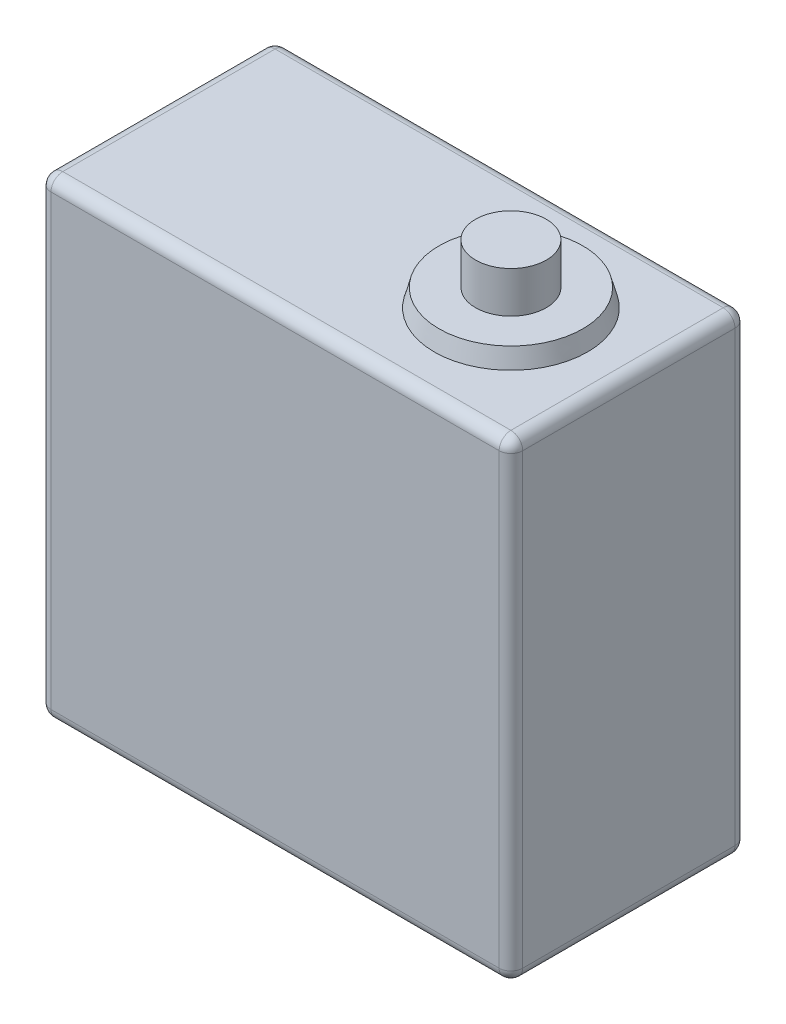
ISO-10303-21;
HEADER;
FILE_DESCRIPTION(('STEP AP214'),'2;1');
FILE_NAME('part.step','',(''),(''),'','','');
FILE_SCHEMA(('AUTOMOTIVE_DESIGN { 1 0 10303 214 1 1 1 1 }'));
ENDSEC;
DATA;
#1=APPLICATION_CONTEXT('core data for automotive mechanical design processes');
#2=APPLICATION_PROTOCOL_DEFINITION('international standard','automotive_design',2000,#1);
#3=PRODUCT_CONTEXT('',#1,'mechanical');
#4=PRODUCT('Part','Part','',(#3));
#5=PRODUCT_RELATED_PRODUCT_CATEGORY('part','',(#4));
#6=PRODUCT_DEFINITION_FORMATION('','',#4);
#7=PRODUCT_DEFINITION_CONTEXT('part definition',#1,'design');
#8=PRODUCT_DEFINITION('design','',#6,#7);
#9=PRODUCT_DEFINITION_SHAPE('','',#8);
#10=(LENGTH_UNIT() NAMED_UNIT(*) SI_UNIT(.MILLI.,.METRE.));
#11=(NAMED_UNIT(*) PLANE_ANGLE_UNIT() SI_UNIT($,.RADIAN.));
#12=(NAMED_UNIT(*) SI_UNIT($,.STERADIAN.) SOLID_ANGLE_UNIT());
#13=UNCERTAINTY_MEASURE_WITH_UNIT(LENGTH_MEASURE(1.E-05),#10,'distance_accuracy_value','');
#14=(GEOMETRIC_REPRESENTATION_CONTEXT(3) GLOBAL_UNCERTAINTY_ASSIGNED_CONTEXT((#13)) GLOBAL_UNIT_ASSIGNED_CONTEXT((#10,
#11,#12)) REPRESENTATION_CONTEXT('',''));
#15=CARTESIAN_POINT('',(0.,0.,0.));
#16=DIRECTION('',(0.,0.,1.));
#17=DIRECTION('',(1.,0.,0.));
#18=AXIS2_PLACEMENT_3D('',#15,#16,#17);
#19=CARTESIAN_POINT('',(20.,20.,20.));
#20=DIRECTION('',(-1.,0.,0.));
#21=DIRECTION('',(0.,-1.,0.));
#22=AXIS2_PLACEMENT_3D('',#19,#20,#21);
#23=PLANE('',#22);
#24=DIRECTION('',(0.,0.,-1.));
#25=VECTOR('',#24,1.);
#26=CARTESIAN_POINT('',(20.,-19.,20.));
#27=LINE('',#26,#25);
#28=CARTESIAN_POINT('',(20.,-19.,19.));
#29=VERTEX_POINT('',#28);
#30=CARTESIAN_POINT('',(20.,-19.,1.));
#31=VERTEX_POINT('',#30);
#32=EDGE_CURVE('E167',#29,#31,#27,.T.);
#33=ORIENTED_EDGE('',*,*,#32,.T.);
#34=DIRECTION('',(0.,1.,0.));
#35=VECTOR('',#34,1.);
#36=CARTESIAN_POINT('',(20.,20.,1.));
#37=LINE('',#36,#35);
#38=CARTESIAN_POINT('',(20.,19.,1.));
#39=VERTEX_POINT('',#38);
#40=EDGE_CURVE('E302',#31,#39,#37,.T.);
#41=ORIENTED_EDGE('',*,*,#40,.T.);
#42=DIRECTION('',(0.,0.,-1.));
#43=VECTOR('',#42,1.);
#44=CARTESIAN_POINT('',(20.,19.,20.));
#45=LINE('',#44,#43);
#46=CARTESIAN_POINT('',(20.,19.,19.));
#47=VERTEX_POINT('',#46);
#48=EDGE_CURVE('E294',#39,#47,#45,.F.);
#49=ORIENTED_EDGE('',*,*,#48,.T.);
#50=DIRECTION('',(0.,1.,0.));
#51=VECTOR('',#50,1.);
#52=CARTESIAN_POINT('',(20.,-20.,19.));
#53=LINE('',#52,#51);
#54=EDGE_CURVE('E290',#47,#29,#53,.F.);
#55=ORIENTED_EDGE('',*,*,#54,.T.);
#56=EDGE_LOOP('',(#33,#41,#49,#55));
#57=FACE_BOUND('',#56,.T.);
#58=ADVANCED_FACE('F41',(#57),#23,.F.);
#59=CARTESIAN_POINT('',(-20.,20.,20.));
#60=DIRECTION('',(0.,-1.,0.));
#61=DIRECTION('',(0.,0.,-1.));
#62=AXIS2_PLACEMENT_3D('',#59,#60,#61);
#63=PLANE('',#62);
#64=CARTESIAN_POINT('',(10.,20.,10.));
#65=DIRECTION('',(0.,-1.,0.));
#66=DIRECTION('',(0.,0.,-1.));
#67=AXIS2_PLACEMENT_3D('',#64,#65,#66);
#68=CIRCLE('',#67,6.5);
#69=CARTESIAN_POINT('',(10.,20.,3.5));
#70=VERTEX_POINT('',#69);
#71=EDGE_CURVE('E229',#70,#70,#68,.F.);
#72=ORIENTED_EDGE('',*,*,#71,.F.);
#73=EDGE_LOOP('',(#72));
#74=FACE_BOUND('',#73,.T.);
#75=DIRECTION('',(0.,0.,-1.));
#76=VECTOR('',#75,1.);
#77=CARTESIAN_POINT('',(-19.,20.,20.));
#78=LINE('',#77,#76);
#79=CARTESIAN_POINT('',(-19.,20.,1.));
#80=VERTEX_POINT('',#79);
#81=CARTESIAN_POINT('',(-19.,20.,19.));
#82=VERTEX_POINT('',#81);
#83=EDGE_CURVE('E309',#80,#82,#78,.F.);
#84=ORIENTED_EDGE('',*,*,#83,.T.);
#85=DIRECTION('',(-1.,0.,0.));
#86=VECTOR('',#85,1.);
#87=CARTESIAN_POINT('',(20.,20.,19.));
#88=LINE('',#87,#86);
#89=CARTESIAN_POINT('',(19.,20.,19.));
#90=VERTEX_POINT('',#89);
#91=EDGE_CURVE('E316',#82,#90,#88,.F.);
#92=ORIENTED_EDGE('',*,*,#91,.T.);
#93=DIRECTION('',(0.,0.,-1.));
#94=VECTOR('',#93,1.);
#95=CARTESIAN_POINT('',(19.,20.,20.));
#96=LINE('',#95,#94);
#97=CARTESIAN_POINT('',(19.,20.,1.));
#98=VERTEX_POINT('',#97);
#99=EDGE_CURVE('E312',#90,#98,#96,.T.);
#100=ORIENTED_EDGE('',*,*,#99,.T.);
#101=DIRECTION('',(-1.,0.,0.));
#102=VECTOR('',#101,1.);
#103=CARTESIAN_POINT('',(-20.,20.,1.));
#104=LINE('',#103,#102);
#105=EDGE_CURVE('E306',#98,#80,#104,.T.);
#106=ORIENTED_EDGE('',*,*,#105,.T.);
#107=EDGE_LOOP('',(#84,#92,#100,#106));
#108=FACE_BOUND('',#107,.T.);
#109=ADVANCED_FACE('F356',(#74,#108),#63,.F.);
#110=CARTESIAN_POINT('',(-20.,20.,20.));
#111=DIRECTION('',(1.,0.,0.));
#112=DIRECTION('',(0.,1.,0.));
#113=AXIS2_PLACEMENT_3D('',#110,#111,#112);
#114=PLANE('',#113);
#115=DIRECTION('',(0.,0.,-1.));
#116=VECTOR('',#115,1.);
#117=CARTESIAN_POINT('',(-20.,-19.,20.));
#118=LINE('',#117,#116);
#119=CARTESIAN_POINT('',(-20.,-19.,1.));
#120=VERTEX_POINT('',#119);
#121=CARTESIAN_POINT('',(-20.,-19.,19.));
#122=VERTEX_POINT('',#121);
#123=EDGE_CURVE('E322',#120,#122,#118,.F.);
#124=ORIENTED_EDGE('',*,*,#123,.T.);
#125=DIRECTION('',(0.,-1.,0.));
#126=VECTOR('',#125,1.);
#127=CARTESIAN_POINT('',(-20.,20.,19.));
#128=LINE('',#127,#126);
#129=CARTESIAN_POINT('',(-20.,19.,19.));
#130=VERTEX_POINT('',#129);
#131=EDGE_CURVE('E329',#122,#130,#128,.F.);
#132=ORIENTED_EDGE('',*,*,#131,.T.);
#133=DIRECTION('',(0.,0.,-1.));
#134=VECTOR('',#133,1.);
#135=CARTESIAN_POINT('',(-20.,19.,20.));
#136=LINE('',#135,#134);
#137=CARTESIAN_POINT('',(-20.,19.,1.));
#138=VERTEX_POINT('',#137);
#139=EDGE_CURVE('E325',#130,#138,#136,.T.);
#140=ORIENTED_EDGE('',*,*,#139,.T.);
#141=DIRECTION('',(0.,-1.,0.));
#142=VECTOR('',#141,1.);
#143=CARTESIAN_POINT('',(-20.,20.,1.));
#144=LINE('',#143,#142);
#145=EDGE_CURVE('E319',#138,#120,#144,.T.);
#146=ORIENTED_EDGE('',*,*,#145,.T.);
#147=EDGE_LOOP('',(#124,#132,#140,#146));
#148=FACE_BOUND('',#147,.T.);
#149=ADVANCED_FACE('F367',(#148),#114,.F.);
#150=CARTESIAN_POINT('',(-20.,-20.,20.));
#151=DIRECTION('',(0.,1.,0.));
#152=DIRECTION('',(0.,0.,1.));
#153=AXIS2_PLACEMENT_3D('',#150,#151,#152);
#154=PLANE('',#153);
#155=CARTESIAN_POINT('',(10.,-20.,10.));
#156=DIRECTION('',(0.,1.,0.));
#157=DIRECTION('',(0.,0.,1.));
#158=AXIS2_PLACEMENT_3D('',#155,#156,#157);
#159=CIRCLE('',#158,6.5);
#160=CARTESIAN_POINT('',(10.,-20.,16.5));
#161=VERTEX_POINT('',#160);
#162=EDGE_CURVE('E45',#161,#161,#159,.F.);
#163=ORIENTED_EDGE('',*,*,#162,.F.);
#164=EDGE_LOOP('',(#163));
#165=FACE_BOUND('',#164,.T.);
#166=DIRECTION('',(0.,0.,-1.));
#167=VECTOR('',#166,1.);
#168=CARTESIAN_POINT('',(-19.,-20.,20.));
#169=LINE('',#168,#167);
#170=CARTESIAN_POINT('',(-19.,-20.,19.));
#171=VERTEX_POINT('',#170);
#172=CARTESIAN_POINT('',(-19.,-20.,1.));
#173=VERTEX_POINT('',#172);
#174=EDGE_CURVE('E143',#171,#173,#169,.T.);
#175=ORIENTED_EDGE('',*,*,#174,.T.);
#176=DIRECTION('',(1.,0.,0.));
#177=VECTOR('',#176,1.);
#178=CARTESIAN_POINT('',(-20.,-20.,1.));
#179=LINE('',#178,#177);
#180=CARTESIAN_POINT('',(19.,-20.,1.));
#181=VERTEX_POINT('',#180);
#182=EDGE_CURVE('E138',#173,#181,#179,.T.);
#183=ORIENTED_EDGE('',*,*,#182,.T.);
#184=DIRECTION('',(0.,0.,-1.));
#185=VECTOR('',#184,1.);
#186=CARTESIAN_POINT('',(19.,-20.,20.));
#187=LINE('',#186,#185);
#188=CARTESIAN_POINT('',(19.,-20.,19.));
#189=VERTEX_POINT('',#188);
#190=EDGE_CURVE('E132',#181,#189,#187,.F.);
#191=ORIENTED_EDGE('',*,*,#190,.T.);
#192=DIRECTION('',(1.,0.,0.));
#193=VECTOR('',#192,1.);
#194=CARTESIAN_POINT('',(-20.,-20.,19.));
#195=LINE('',#194,#193);
#196=EDGE_CURVE('E135',#189,#171,#195,.F.);
#197=ORIENTED_EDGE('',*,*,#196,.T.);
#198=EDGE_LOOP('',(#175,#183,#191,#197));
#199=FACE_BOUND('',#198,.T.);
#200=ADVANCED_FACE('F134',(#165,#199),#154,.F.);
#201=CARTESIAN_POINT('',(0.,0.,20.));
#202=DIRECTION('',(0.,0.,1.));
#203=DIRECTION('',(1.,0.,0.));
#204=AXIS2_PLACEMENT_3D('',#201,#202,#203);
#205=PLANE('',#204);
#206=DIRECTION('',(0.,-1.,0.));
#207=VECTOR('',#206,1.);
#208=CARTESIAN_POINT('',(-19.,-20.,20.));
#209=LINE('',#208,#207);
#210=CARTESIAN_POINT('',(-19.,19.,20.));
#211=VERTEX_POINT('',#210);
#212=CARTESIAN_POINT('',(-19.,-19.,20.));
#213=VERTEX_POINT('',#212);
#214=EDGE_CURVE('E58',#211,#213,#209,.T.);
#215=ORIENTED_EDGE('',*,*,#214,.T.);
#216=DIRECTION('',(1.,0.,0.));
#217=VECTOR('',#216,1.);
#218=CARTESIAN_POINT('',(20.,-19.,20.));
#219=LINE('',#218,#217);
#220=CARTESIAN_POINT('',(19.,-19.,20.));
#221=VERTEX_POINT('',#220);
#222=EDGE_CURVE('E233',#213,#221,#219,.T.);
#223=ORIENTED_EDGE('',*,*,#222,.T.);
#224=DIRECTION('',(0.,1.,0.));
#225=VECTOR('',#224,1.);
#226=CARTESIAN_POINT('',(19.,20.,20.));
#227=LINE('',#226,#225);
#228=CARTESIAN_POINT('',(19.,19.,20.));
#229=VERTEX_POINT('',#228);
#230=EDGE_CURVE('E332',#221,#229,#227,.T.);
#231=ORIENTED_EDGE('',*,*,#230,.T.);
#232=DIRECTION('',(-1.,0.,0.));
#233=VECTOR('',#232,1.);
#234=CARTESIAN_POINT('',(-20.,19.,20.));
#235=LINE('',#234,#233);
#236=EDGE_CURVE('E63',#229,#211,#235,.T.);
#237=ORIENTED_EDGE('',*,*,#236,.T.);
#238=EDGE_LOOP('',(#215,#223,#231,#237));
#239=FACE_BOUND('',#238,.T.);
#240=ADVANCED_FACE('F335',(#239),#205,.T.);
#241=CARTESIAN_POINT('',(0.,0.,0.));
#242=DIRECTION('',(0.,0.,1.));
#243=DIRECTION('',(1.,0.,0.));
#244=AXIS2_PLACEMENT_3D('',#241,#242,#243);
#245=PLANE('',#244);
#246=DIRECTION('',(0.,1.,0.));
#247=VECTOR('',#246,1.);
#248=CARTESIAN_POINT('',(19.,0.,0.));
#249=LINE('',#248,#247);
#250=CARTESIAN_POINT('',(19.,19.,0.));
#251=VERTEX_POINT('',#250);
#252=CARTESIAN_POINT('',(19.,-19.,0.));
#253=VERTEX_POINT('',#252);
#254=EDGE_CURVE('E279',#251,#253,#249,.F.);
#255=ORIENTED_EDGE('',*,*,#254,.T.);
#256=DIRECTION('',(1.,0.,0.));
#257=VECTOR('',#256,1.);
#258=CARTESIAN_POINT('',(0.,-19.,0.));
#259=LINE('',#258,#257);
#260=CARTESIAN_POINT('',(-19.,-19.,0.));
#261=VERTEX_POINT('',#260);
#262=EDGE_CURVE('E283',#253,#261,#259,.F.);
#263=ORIENTED_EDGE('',*,*,#262,.T.);
#264=DIRECTION('',(0.,-1.,0.));
#265=VECTOR('',#264,1.);
#266=CARTESIAN_POINT('',(-19.,0.,0.));
#267=LINE('',#266,#265);
#268=CARTESIAN_POINT('',(-19.,19.,0.));
#269=VERTEX_POINT('',#268);
#270=EDGE_CURVE('E272',#261,#269,#267,.F.);
#271=ORIENTED_EDGE('',*,*,#270,.T.);
#272=DIRECTION('',(-1.,0.,0.));
#273=VECTOR('',#272,1.);
#274=CARTESIAN_POINT('',(0.,19.,0.));
#275=LINE('',#274,#273);
#276=EDGE_CURVE('E280',#269,#251,#275,.F.);
#277=ORIENTED_EDGE('',*,*,#276,.T.);
#278=EDGE_LOOP('',(#255,#263,#271,#277));
#279=FACE_BOUND('',#278,.T.);
#280=ADVANCED_FACE('F284',(#279),#245,.F.);
#281=CARTESIAN_POINT('',(0.,19.,19.));
#282=DIRECTION('',(1.,0.,0.));
#283=DIRECTION('',(0.,0.,-1.));
#284=AXIS2_PLACEMENT_3D('',#281,#282,#283);
#285=CYLINDRICAL_SURFACE('',#284,1.);
#286=CARTESIAN_POINT('',(-19.,19.,19.));
#287=DIRECTION('',(-1.,0.,0.));
#288=DIRECTION('',(0.,-1.,0.));
#289=AXIS2_PLACEMENT_3D('',#286,#287,#288);
#290=CIRCLE('',#289,1.);
#291=EDGE_CURVE('E155',#211,#82,#290,.T.);
#292=ORIENTED_EDGE('',*,*,#291,.F.);
#293=ORIENTED_EDGE('',*,*,#236,.F.);
#294=CARTESIAN_POINT('',(19.,19.,19.));
#295=DIRECTION('',(1.,0.,0.));
#296=DIRECTION('',(0.,0.,-1.));
#297=AXIS2_PLACEMENT_3D('',#294,#295,#296);
#298=CIRCLE('',#297,1.);
#299=EDGE_CURVE('E223',#90,#229,#298,.T.);
#300=ORIENTED_EDGE('',*,*,#299,.F.);
#301=ORIENTED_EDGE('',*,*,#91,.F.);
#302=EDGE_LOOP('',(#292,#293,#300,#301));
#303=FACE_BOUND('',#302,.T.);
#304=ADVANCED_FACE('F43',(#303),#285,.T.);
#305=CARTESIAN_POINT('',(-19.,19.,19.));
#306=DIRECTION('',(0.,1.,0.));
#307=DIRECTION('',(0.,0.,1.));
#308=AXIS2_PLACEMENT_3D('',#305,#306,#307);
#309=SPHERICAL_SURFACE('',#308,1.);
#310=CARTESIAN_POINT('',(-19.,19.,19.));
#311=DIRECTION('',(0.,1.,0.));
#312=DIRECTION('',(0.,0.,1.));
#313=AXIS2_PLACEMENT_3D('',#310,#311,#312);
#314=CIRCLE('',#313,1.);
#315=EDGE_CURVE('E215',#211,#130,#314,.F.);
#316=ORIENTED_EDGE('',*,*,#315,.F.);
#317=ORIENTED_EDGE('',*,*,#291,.T.);
#318=CARTESIAN_POINT('',(-19.,19.,19.));
#319=DIRECTION('',(0.,0.,1.));
#320=DIRECTION('',(1.,0.,0.));
#321=AXIS2_PLACEMENT_3D('',#318,#319,#320);
#322=CIRCLE('',#321,1.);
#323=EDGE_CURVE('E219',#130,#82,#322,.F.);
#324=ORIENTED_EDGE('',*,*,#323,.F.);
#325=EDGE_LOOP('',(#316,#317,#324));
#326=FACE_BOUND('',#325,.T.);
#327=ADVANCED_FACE('F360',(#326),#309,.T.);
#328=CARTESIAN_POINT('',(19.,19.,19.));
#329=DIRECTION('',(0.,0.,1.));
#330=DIRECTION('',(1.,0.,0.));
#331=AXIS2_PLACEMENT_3D('',#328,#329,#330);
#332=SPHERICAL_SURFACE('',#331,1.);
#333=CARTESIAN_POINT('',(19.,19.,19.));
#334=DIRECTION('',(0.,0.,1.));
#335=DIRECTION('',(1.,0.,0.));
#336=AXIS2_PLACEMENT_3D('',#333,#334,#335);
#337=CIRCLE('',#336,1.);
#338=EDGE_CURVE('E207',#90,#47,#337,.F.);
#339=ORIENTED_EDGE('',*,*,#338,.F.);
#340=ORIENTED_EDGE('',*,*,#299,.T.);
#341=CARTESIAN_POINT('',(19.,19.,19.));
#342=DIRECTION('',(0.,1.,0.));
#343=DIRECTION('',(0.,0.,1.));
#344=AXIS2_PLACEMENT_3D('',#341,#342,#343);
#345=CIRCLE('',#344,1.);
#346=EDGE_CURVE('E211',#47,#229,#345,.F.);
#347=ORIENTED_EDGE('',*,*,#346,.F.);
#348=EDGE_LOOP('',(#339,#340,#347));
#349=FACE_BOUND('',#348,.T.);
#350=ADVANCED_FACE('F344',(#349),#332,.T.);
#351=CARTESIAN_POINT('',(-19.,19.,20.));
#352=DIRECTION('',(0.,0.,-1.));
#353=DIRECTION('',(-1.,0.,0.));
#354=AXIS2_PLACEMENT_3D('',#351,#352,#353);
#355=CYLINDRICAL_SURFACE('',#354,1.);
#356=ORIENTED_EDGE('',*,*,#323,.T.);
#357=ORIENTED_EDGE('',*,*,#83,.F.);
#358=CARTESIAN_POINT('',(-19.,19.,1.));
#359=DIRECTION('',(0.,0.,-1.));
#360=DIRECTION('',(-1.,0.,0.));
#361=AXIS2_PLACEMENT_3D('',#358,#359,#360);
#362=CIRCLE('',#361,1.);
#363=EDGE_CURVE('E199',#138,#80,#362,.T.);
#364=ORIENTED_EDGE('',*,*,#363,.F.);
#365=ORIENTED_EDGE('',*,*,#139,.F.);
#366=EDGE_LOOP('',(#356,#357,#364,#365));
#367=FACE_BOUND('',#366,.T.);
#368=ADVANCED_FACE('F363',(#367),#355,.T.);
#369=CARTESIAN_POINT('',(-19.,0.,19.));
#370=DIRECTION('',(0.,1.,0.));
#371=DIRECTION('',(-1.,0.,0.));
#372=AXIS2_PLACEMENT_3D('',#369,#370,#371);
#373=CYLINDRICAL_SURFACE('',#372,1.);
#374=ORIENTED_EDGE('',*,*,#315,.T.);
#375=ORIENTED_EDGE('',*,*,#131,.F.);
#376=CARTESIAN_POINT('',(-19.,-19.,19.));
#377=DIRECTION('',(0.,-1.,0.));
#378=DIRECTION('',(0.,0.,-1.));
#379=AXIS2_PLACEMENT_3D('',#376,#377,#378);
#380=CIRCLE('',#379,1.);
#381=EDGE_CURVE('E195',#213,#122,#380,.T.);
#382=ORIENTED_EDGE('',*,*,#381,.F.);
#383=ORIENTED_EDGE('',*,*,#214,.F.);
#384=EDGE_LOOP('',(#374,#375,#382,#383));
#385=FACE_BOUND('',#384,.T.);
#386=ADVANCED_FACE('F372',(#385),#373,.T.);
#387=CARTESIAN_POINT('',(0.,-19.,19.));
#388=DIRECTION('',(-1.,0.,0.));
#389=DIRECTION('',(0.,0.,1.));
#390=AXIS2_PLACEMENT_3D('',#387,#388,#389);
#391=CYLINDRICAL_SURFACE('',#390,1.);
#392=CARTESIAN_POINT('',(19.,-19.,19.));
#393=DIRECTION('',(1.,0.,0.));
#394=DIRECTION('',(0.,0.,-1.));
#395=AXIS2_PLACEMENT_3D('',#392,#393,#394);
#396=CIRCLE('',#395,1.);
#397=EDGE_CURVE('E149',#221,#189,#396,.T.);
#398=ORIENTED_EDGE('',*,*,#397,.F.);
#399=ORIENTED_EDGE('',*,*,#222,.F.);
#400=CARTESIAN_POINT('',(-19.,-19.,19.));
#401=DIRECTION('',(-1.,0.,0.));
#402=DIRECTION('',(0.,0.,1.));
#403=AXIS2_PLACEMENT_3D('',#400,#401,#402);
#404=CIRCLE('',#403,1.);
#405=EDGE_CURVE('E152',#171,#213,#404,.T.);
#406=ORIENTED_EDGE('',*,*,#405,.F.);
#407=ORIENTED_EDGE('',*,*,#196,.F.);
#408=EDGE_LOOP('',(#398,#399,#406,#407));
#409=FACE_BOUND('',#408,.T.);
#410=ADVANCED_FACE('F148',(#409),#391,.T.);
#411=CARTESIAN_POINT('',(19.,0.,19.));
#412=DIRECTION('',(0.,-1.,0.));
#413=DIRECTION('',(1.,0.,0.));
#414=AXIS2_PLACEMENT_3D('',#411,#412,#413);
#415=CYLINDRICAL_SURFACE('',#414,1.);
#416=ORIENTED_EDGE('',*,*,#346,.T.);
#417=ORIENTED_EDGE('',*,*,#230,.F.);
#418=CARTESIAN_POINT('',(19.,-19.,19.));
#419=DIRECTION('',(0.,-1.,0.));
#420=DIRECTION('',(0.,0.,-1.));
#421=AXIS2_PLACEMENT_3D('',#418,#419,#420);
#422=CIRCLE('',#421,1.);
#423=EDGE_CURVE('E163',#29,#221,#422,.T.);
#424=ORIENTED_EDGE('',*,*,#423,.F.);
#425=ORIENTED_EDGE('',*,*,#54,.F.);
#426=EDGE_LOOP('',(#416,#417,#424,#425));
#427=FACE_BOUND('',#426,.T.);
#428=ADVANCED_FACE('F347',(#427),#415,.T.);
#429=CARTESIAN_POINT('',(19.,19.,20.));
#430=DIRECTION('',(0.,0.,-1.));
#431=DIRECTION('',(-1.,0.,0.));
#432=AXIS2_PLACEMENT_3D('',#429,#430,#431);
#433=CYLINDRICAL_SURFACE('',#432,1.);
#434=ORIENTED_EDGE('',*,*,#338,.T.);
#435=ORIENTED_EDGE('',*,*,#48,.F.);
#436=CARTESIAN_POINT('',(19.,19.,1.));
#437=DIRECTION('',(0.,0.,-1.));
#438=DIRECTION('',(-1.,0.,0.));
#439=AXIS2_PLACEMENT_3D('',#436,#437,#438);
#440=CIRCLE('',#439,1.);
#441=EDGE_CURVE('E187',#98,#39,#440,.T.);
#442=ORIENTED_EDGE('',*,*,#441,.F.);
#443=ORIENTED_EDGE('',*,*,#99,.F.);
#444=EDGE_LOOP('',(#434,#435,#442,#443));
#445=FACE_BOUND('',#444,.T.);
#446=ADVANCED_FACE('F353',(#445),#433,.T.);
#447=CARTESIAN_POINT('',(-20.,19.,1.));
#448=DIRECTION('',(-1.,0.,0.));
#449=DIRECTION('',(0.,0.,1.));
#450=AXIS2_PLACEMENT_3D('',#447,#448,#449);
#451=CYLINDRICAL_SURFACE('',#450,1.);
#452=CARTESIAN_POINT('',(-19.,19.,1.));
#453=DIRECTION('',(-1.,0.,0.));
#454=DIRECTION('',(0.,0.,1.));
#455=AXIS2_PLACEMENT_3D('',#452,#453,#454);
#456=CIRCLE('',#455,1.);
#457=EDGE_CURVE('E203',#80,#269,#456,.T.);
#458=ORIENTED_EDGE('',*,*,#457,.F.);
#459=ORIENTED_EDGE('',*,*,#105,.F.);
#460=CARTESIAN_POINT('',(19.,19.,1.));
#461=DIRECTION('',(1.,0.,0.));
#462=DIRECTION('',(0.,0.,-1.));
#463=AXIS2_PLACEMENT_3D('',#460,#461,#462);
#464=CIRCLE('',#463,1.);
#465=EDGE_CURVE('E184',#251,#98,#464,.T.);
#466=ORIENTED_EDGE('',*,*,#465,.F.);
#467=ORIENTED_EDGE('',*,*,#276,.F.);
#468=EDGE_LOOP('',(#458,#459,#466,#467));
#469=FACE_BOUND('',#468,.T.);
#470=ADVANCED_FACE('F388',(#469),#451,.T.);
#471=CARTESIAN_POINT('',(-19.,19.,1.));
#472=DIRECTION('',(0.,1.,0.));
#473=DIRECTION('',(0.,0.,1.));
#474=AXIS2_PLACEMENT_3D('',#471,#472,#473);
#475=SPHERICAL_SURFACE('',#474,1.);
#476=ORIENTED_EDGE('',*,*,#363,.T.);
#477=ORIENTED_EDGE('',*,*,#457,.T.);
#478=CARTESIAN_POINT('',(-19.,19.,1.));
#479=DIRECTION('',(0.,1.,0.));
#480=DIRECTION('',(0.,0.,1.));
#481=AXIS2_PLACEMENT_3D('',#478,#479,#480);
#482=CIRCLE('',#481,1.);
#483=EDGE_CURVE('E175',#138,#269,#482,.F.);
#484=ORIENTED_EDGE('',*,*,#483,.F.);
#485=EDGE_LOOP('',(#476,#477,#484));
#486=FACE_BOUND('',#485,.T.);
#487=ADVANCED_FACE('F592',(#486),#475,.T.);
#488=CARTESIAN_POINT('',(-19.,-19.,19.));
#489=DIRECTION('',(0.,0.,1.));
#490=DIRECTION('',(1.,0.,0.));
#491=AXIS2_PLACEMENT_3D('',#488,#489,#490);
#492=SPHERICAL_SURFACE('',#491,1.);
#493=ORIENTED_EDGE('',*,*,#405,.T.);
#494=ORIENTED_EDGE('',*,*,#381,.T.);
#495=CARTESIAN_POINT('',(-19.,-19.,19.));
#496=DIRECTION('',(0.,0.,1.));
#497=DIRECTION('',(1.,0.,0.));
#498=AXIS2_PLACEMENT_3D('',#495,#496,#497);
#499=CIRCLE('',#498,1.);
#500=EDGE_CURVE('E169',#171,#122,#499,.F.);
#501=ORIENTED_EDGE('',*,*,#500,.F.);
#502=EDGE_LOOP('',(#493,#494,#501));
#503=FACE_BOUND('',#502,.T.);
#504=ADVANCED_FACE('F374',(#503),#492,.T.);
#505=CARTESIAN_POINT('',(19.,-19.,19.));
#506=DIRECTION('',(0.,0.,1.));
#507=DIRECTION('',(1.,0.,0.));
#508=AXIS2_PLACEMENT_3D('',#505,#506,#507);
#509=SPHERICAL_SURFACE('',#508,1.);
#510=ORIENTED_EDGE('',*,*,#423,.T.);
#511=ORIENTED_EDGE('',*,*,#397,.T.);
#512=CARTESIAN_POINT('',(19.,-19.,19.));
#513=DIRECTION('',(0.,0.,1.));
#514=DIRECTION('',(1.,0.,0.));
#515=AXIS2_PLACEMENT_3D('',#512,#513,#514);
#516=CIRCLE('',#515,1.);
#517=EDGE_CURVE('E160',#29,#189,#516,.F.);
#518=ORIENTED_EDGE('',*,*,#517,.F.);
#519=EDGE_LOOP('',(#510,#511,#518));
#520=FACE_BOUND('',#519,.T.);
#521=ADVANCED_FACE('F159',(#520),#509,.T.);
#522=CARTESIAN_POINT('',(19.,19.,1.));
#523=DIRECTION('',(0.,1.,0.));
#524=DIRECTION('',(0.,0.,1.));
#525=AXIS2_PLACEMENT_3D('',#522,#523,#524);
#526=SPHERICAL_SURFACE('',#525,1.);
#527=ORIENTED_EDGE('',*,*,#465,.T.);
#528=ORIENTED_EDGE('',*,*,#441,.T.);
#529=CARTESIAN_POINT('',(19.,19.,1.));
#530=DIRECTION('',(0.,1.,0.));
#531=DIRECTION('',(0.,0.,1.));
#532=AXIS2_PLACEMENT_3D('',#529,#530,#531);
#533=CIRCLE('',#532,1.);
#534=EDGE_CURVE('E170',#251,#39,#533,.F.);
#535=ORIENTED_EDGE('',*,*,#534,.F.);
#536=EDGE_LOOP('',(#527,#528,#535));
#537=FACE_BOUND('',#536,.T.);
#538=ADVANCED_FACE('F390',(#537),#526,.T.);
#539=CARTESIAN_POINT('',(-19.,20.,1.));
#540=DIRECTION('',(0.,-1.,0.));
#541=DIRECTION('',(1.,0.,0.));
#542=AXIS2_PLACEMENT_3D('',#539,#540,#541);
#543=CYLINDRICAL_SURFACE('',#542,1.);
#544=ORIENTED_EDGE('',*,*,#483,.T.);
#545=ORIENTED_EDGE('',*,*,#270,.F.);
#546=CARTESIAN_POINT('',(-19.,-19.,1.));
#547=DIRECTION('',(0.,-1.,0.));
#548=DIRECTION('',(0.,0.,-1.));
#549=AXIS2_PLACEMENT_3D('',#546,#547,#548);
#550=CIRCLE('',#549,1.);
#551=EDGE_CURVE('E177',#120,#261,#550,.T.);
#552=ORIENTED_EDGE('',*,*,#551,.F.);
#553=ORIENTED_EDGE('',*,*,#145,.F.);
#554=EDGE_LOOP('',(#544,#545,#552,#553));
#555=FACE_BOUND('',#554,.T.);
#556=ADVANCED_FACE('F274',(#555),#543,.T.);
#557=CARTESIAN_POINT('',(-19.,-19.,20.));
#558=DIRECTION('',(0.,0.,-1.));
#559=DIRECTION('',(-1.,0.,0.));
#560=AXIS2_PLACEMENT_3D('',#557,#558,#559);
#561=CYLINDRICAL_SURFACE('',#560,1.);
#562=ORIENTED_EDGE('',*,*,#500,.T.);
#563=ORIENTED_EDGE('',*,*,#123,.F.);
#564=CARTESIAN_POINT('',(-19.,-19.,1.));
#565=DIRECTION('',(0.,0.,-1.));
#566=DIRECTION('',(-1.,0.,0.));
#567=AXIS2_PLACEMENT_3D('',#564,#565,#566);
#568=CIRCLE('',#567,1.);
#569=EDGE_CURVE('E260',#173,#120,#568,.T.);
#570=ORIENTED_EDGE('',*,*,#569,.F.);
#571=ORIENTED_EDGE('',*,*,#174,.F.);
#572=EDGE_LOOP('',(#562,#563,#570,#571));
#573=FACE_BOUND('',#572,.T.);
#574=ADVANCED_FACE('F377',(#573),#561,.T.);
#575=CARTESIAN_POINT('',(19.,-19.,20.));
#576=DIRECTION('',(0.,0.,-1.));
#577=DIRECTION('',(-1.,0.,0.));
#578=AXIS2_PLACEMENT_3D('',#575,#576,#577);
#579=CYLINDRICAL_SURFACE('',#578,1.);
#580=ORIENTED_EDGE('',*,*,#517,.T.);
#581=ORIENTED_EDGE('',*,*,#190,.F.);
#582=CARTESIAN_POINT('',(19.,-19.,1.));
#583=DIRECTION('',(0.,0.,-1.));
#584=DIRECTION('',(-1.,0.,0.));
#585=AXIS2_PLACEMENT_3D('',#582,#583,#584);
#586=CIRCLE('',#585,1.);
#587=EDGE_CURVE('E256',#31,#181,#586,.T.);
#588=ORIENTED_EDGE('',*,*,#587,.F.);
#589=ORIENTED_EDGE('',*,*,#32,.F.);
#590=EDGE_LOOP('',(#580,#581,#588,#589));
#591=FACE_BOUND('',#590,.T.);
#592=ADVANCED_FACE('F166',(#591),#579,.T.);
#593=CARTESIAN_POINT('',(19.,20.,1.));
#594=DIRECTION('',(0.,1.,0.));
#595=DIRECTION('',(-1.,0.,0.));
#596=AXIS2_PLACEMENT_3D('',#593,#594,#595);
#597=CYLINDRICAL_SURFACE('',#596,1.);
#598=ORIENTED_EDGE('',*,*,#534,.T.);
#599=ORIENTED_EDGE('',*,*,#40,.F.);
#600=CARTESIAN_POINT('',(19.,-19.,1.));
#601=DIRECTION('',(0.,-1.,0.));
#602=DIRECTION('',(0.,0.,-1.));
#603=AXIS2_PLACEMENT_3D('',#600,#601,#602);
#604=CIRCLE('',#603,1.);
#605=EDGE_CURVE('E252',#253,#31,#604,.T.);
#606=ORIENTED_EDGE('',*,*,#605,.F.);
#607=ORIENTED_EDGE('',*,*,#254,.F.);
#608=EDGE_LOOP('',(#598,#599,#606,#607));
#609=FACE_BOUND('',#608,.T.);
#610=ADVANCED_FACE('F392',(#609),#597,.T.);
#611=CARTESIAN_POINT('',(-19.,-19.,1.));
#612=DIRECTION('',(-1.,0.,0.));
#613=DIRECTION('',(0.,0.,1.));
#614=AXIS2_PLACEMENT_3D('',#611,#612,#613);
#615=SPHERICAL_SURFACE('',#614,1.);
#616=ORIENTED_EDGE('',*,*,#569,.T.);
#617=ORIENTED_EDGE('',*,*,#551,.T.);
#618=CARTESIAN_POINT('',(-19.,-19.,1.));
#619=DIRECTION('',(-1.,0.,0.));
#620=DIRECTION('',(0.,0.,1.));
#621=AXIS2_PLACEMENT_3D('',#618,#619,#620);
#622=CIRCLE('',#621,1.);
#623=EDGE_CURVE('E248',#173,#261,#622,.F.);
#624=ORIENTED_EDGE('',*,*,#623,.F.);
#625=EDGE_LOOP('',(#616,#617,#624));
#626=FACE_BOUND('',#625,.T.);
#627=ADVANCED_FACE('F269',(#626),#615,.T.);
#628=CARTESIAN_POINT('',(19.,-19.,1.));
#629=DIRECTION('',(1.,0.,0.));
#630=DIRECTION('',(0.,0.,-1.));
#631=AXIS2_PLACEMENT_3D('',#628,#629,#630);
#632=SPHERICAL_SURFACE('',#631,1.);
#633=ORIENTED_EDGE('',*,*,#605,.T.);
#634=ORIENTED_EDGE('',*,*,#587,.T.);
#635=CARTESIAN_POINT('',(19.,-19.,1.));
#636=DIRECTION('',(1.,0.,0.));
#637=DIRECTION('',(0.,0.,-1.));
#638=AXIS2_PLACEMENT_3D('',#635,#636,#637);
#639=CIRCLE('',#638,1.);
#640=EDGE_CURVE('E245',#253,#181,#639,.F.);
#641=ORIENTED_EDGE('',*,*,#640,.F.);
#642=EDGE_LOOP('',(#633,#634,#641));
#643=FACE_BOUND('',#642,.T.);
#644=ADVANCED_FACE('F394',(#643),#632,.T.);
#645=CARTESIAN_POINT('',(-20.,-19.,1.));
#646=DIRECTION('',(1.,0.,0.));
#647=DIRECTION('',(0.,0.,-1.));
#648=AXIS2_PLACEMENT_3D('',#645,#646,#647);
#649=CYLINDRICAL_SURFACE('',#648,1.);
#650=ORIENTED_EDGE('',*,*,#623,.T.);
#651=ORIENTED_EDGE('',*,*,#262,.F.);
#652=ORIENTED_EDGE('',*,*,#640,.T.);
#653=ORIENTED_EDGE('',*,*,#182,.F.);
#654=EDGE_LOOP('',(#650,#651,#652,#653));
#655=FACE_BOUND('',#654,.T.);
#656=ADVANCED_FACE('F395',(#655),#649,.T.);
#657=CARTESIAN_POINT('',(10.,20.,10.));
#658=DIRECTION('',(0.,-1.,0.));
#659=DIRECTION('',(0.,0.,1.));
#660=AXIS2_PLACEMENT_3D('',#657,#658,#659);
#661=CONICAL_SURFACE('',#660,6.5,0.26179938779915);
#662=CARTESIAN_POINT('',(10.,21.5,10.));
#663=DIRECTION('',(0.,1.,0.));
#664=DIRECTION('',(0.,0.,1.));
#665=AXIS2_PLACEMENT_3D('',#662,#663,#664);
#666=CIRCLE('',#665,6.09807621135331);
#667=CARTESIAN_POINT('',(10.,21.5,16.0980762113533));
#668=VERTEX_POINT('',#667);
#669=EDGE_CURVE('E249',#668,#668,#666,.T.);
#670=ORIENTED_EDGE('',*,*,#669,.F.);
#671=EDGE_LOOP('',(#670));
#672=FACE_BOUND('',#671,.T.);
#673=ORIENTED_EDGE('',*,*,#71,.T.);
#674=EDGE_LOOP('',(#673));
#675=FACE_BOUND('',#674,.T.);
#676=ADVANCED_FACE('F397',(#672,#675),#661,.T.);
#677=CARTESIAN_POINT('',(10.,21.5,10.));
#678=DIRECTION('',(0.,1.,0.));
#679=DIRECTION('',(0.,0.,1.));
#680=AXIS2_PLACEMENT_3D('',#677,#678,#679);
#681=PLANE('',#680);
#682=CARTESIAN_POINT('',(10.,21.5,10.));
#683=DIRECTION('',(0.,1.,0.));
#684=DIRECTION('',(0.,0.,1.));
#685=AXIS2_PLACEMENT_3D('',#682,#683,#684);
#686=CIRCLE('',#685,3.);
#687=CARTESIAN_POINT('',(10.,21.5,13.));
#688=VERTEX_POINT('',#687);
#689=EDGE_CURVE('E232',#688,#688,#686,.T.);
#690=ORIENTED_EDGE('',*,*,#689,.F.);
#691=EDGE_LOOP('',(#690));
#692=FACE_BOUND('',#691,.T.);
#693=ORIENTED_EDGE('',*,*,#669,.T.);
#694=EDGE_LOOP('',(#693));
#695=FACE_BOUND('',#694,.T.);
#696=ADVANCED_FACE('F403',(#692,#695),#681,.T.);
#697=CARTESIAN_POINT('',(10.,25.,10.));
#698=DIRECTION('',(0.,-1.,0.));
#699=DIRECTION('',(0.,0.,-1.));
#700=AXIS2_PLACEMENT_3D('',#697,#698,#699);
#701=CYLINDRICAL_SURFACE('',#700,3.);
#702=CARTESIAN_POINT('',(10.,25.,10.));
#703=DIRECTION('',(0.,1.,0.));
#704=DIRECTION('',(0.,0.,1.));
#705=AXIS2_PLACEMENT_3D('',#702,#703,#704);
#706=CIRCLE('',#705,3.);
#707=CARTESIAN_POINT('',(10.,25.,13.));
#708=VERTEX_POINT('',#707);
#709=EDGE_CURVE('E460',#708,#708,#706,.T.);
#710=ORIENTED_EDGE('',*,*,#709,.F.);
#711=EDGE_LOOP('',(#710));
#712=FACE_BOUND('',#711,.T.);
#713=ORIENTED_EDGE('',*,*,#689,.T.);
#714=EDGE_LOOP('',(#713));
#715=FACE_BOUND('',#714,.T.);
#716=ADVANCED_FACE('F426',(#712,#715),#701,.T.);
#717=CARTESIAN_POINT('',(10.,25.,10.));
#718=DIRECTION('',(0.,1.,0.));
#719=DIRECTION('',(0.,0.,1.));
#720=AXIS2_PLACEMENT_3D('',#717,#718,#719);
#721=PLANE('',#720);
#722=ORIENTED_EDGE('',*,*,#709,.T.);
#723=EDGE_LOOP('',(#722));
#724=FACE_BOUND('',#723,.T.);
#725=ADVANCED_FACE('F430',(#724),#721,.T.);
#726=CARTESIAN_POINT('',(10.,-20.,10.));
#727=DIRECTION('',(0.,1.,0.));
#728=DIRECTION('',(0.,0.,-1.));
#729=AXIS2_PLACEMENT_3D('',#726,#727,#728);
#730=CONICAL_SURFACE('',#729,6.5,0.26179938779915);
#731=CARTESIAN_POINT('',(10.,-21.5,10.));
#732=DIRECTION('',(0.,-1.,0.));
#733=DIRECTION('',(0.,0.,-1.));
#734=AXIS2_PLACEMENT_3D('',#731,#732,#733);
#735=CIRCLE('',#734,6.09807621135332);
#736=CARTESIAN_POINT('',(10.,-21.5,3.90192378864668));
#737=VERTEX_POINT('',#736);
#738=EDGE_CURVE('E456',#737,#737,#735,.T.);
#739=ORIENTED_EDGE('',*,*,#738,.F.);
#740=EDGE_LOOP('',(#739));
#741=FACE_BOUND('',#740,.T.);
#742=ORIENTED_EDGE('',*,*,#162,.T.);
#743=EDGE_LOOP('',(#742));
#744=FACE_BOUND('',#743,.T.);
#745=ADVANCED_FACE('F434',(#741,#744),#730,.T.);
#746=CARTESIAN_POINT('',(10.,-21.5,10.));
#747=DIRECTION('',(0.,-1.,0.));
#748=DIRECTION('',(0.,0.,-1.));
#749=AXIS2_PLACEMENT_3D('',#746,#747,#748);
#750=PLANE('',#749);
#751=CARTESIAN_POINT('',(10.,-21.5,10.));
#752=DIRECTION('',(0.,-1.,0.));
#753=DIRECTION('',(0.,0.,-1.));
#754=AXIS2_PLACEMENT_3D('',#751,#752,#753);
#755=CIRCLE('',#754,3.);
#756=CARTESIAN_POINT('',(10.,-21.5,7.));
#757=VERTEX_POINT('',#756);
#758=EDGE_CURVE('E11',#757,#757,#755,.T.);
#759=ORIENTED_EDGE('',*,*,#758,.F.);
#760=EDGE_LOOP('',(#759));
#761=FACE_BOUND('',#760,.T.);
#762=ORIENTED_EDGE('',*,*,#738,.T.);
#763=EDGE_LOOP('',(#762));
#764=FACE_BOUND('',#763,.T.);
#765=ADVANCED_FACE('F438',(#761,#764),#750,.T.);
#766=CARTESIAN_POINT('',(10.,-25.,10.));
#767=DIRECTION('',(0.,1.,0.));
#768=DIRECTION('',(0.,0.,1.));
#769=AXIS2_PLACEMENT_3D('',#766,#767,#768);
#770=CYLINDRICAL_SURFACE('',#769,3.);
#771=CARTESIAN_POINT('',(10.,-25.,10.));
#772=DIRECTION('',(0.,-1.,0.));
#773=DIRECTION('',(0.,0.,-1.));
#774=AXIS2_PLACEMENT_3D('',#771,#772,#773);
#775=CIRCLE('',#774,3.);
#776=CARTESIAN_POINT('',(10.,-25.,7.));
#777=VERTEX_POINT('',#776);
#778=EDGE_CURVE('E454',#777,#777,#775,.T.);
#779=ORIENTED_EDGE('',*,*,#778,.F.);
#780=EDGE_LOOP('',(#779));
#781=FACE_BOUND('',#780,.T.);
#782=ORIENTED_EDGE('',*,*,#758,.T.);
#783=EDGE_LOOP('',(#782));
#784=FACE_BOUND('',#783,.T.);
#785=ADVANCED_FACE('F442',(#781,#784),#770,.T.);
#786=CARTESIAN_POINT('',(10.,-25.,10.));
#787=DIRECTION('',(0.,-1.,0.));
#788=DIRECTION('',(0.,0.,-1.));
#789=AXIS2_PLACEMENT_3D('',#786,#787,#788);
#790=PLANE('',#789);
#791=ORIENTED_EDGE('',*,*,#778,.T.);
#792=EDGE_LOOP('',(#791));
#793=FACE_BOUND('',#792,.T.);
#794=ADVANCED_FACE('F446',(#793),#790,.T.);
#795=CLOSED_SHELL('',(#58,#109,#149,#200,#240,#280,#304,#327,#350,#368,#386,#410,#428,#446,#470,
#487,#504,#521,#538,#556,#574,#592,#610,#627,#644,#656,#676,#696,#716,#725,#745,#765,#785,#794));
#796=MANIFOLD_SOLID_BREP('B2',#795);
#797=ADVANCED_BREP_SHAPE_REPRESENTATION('',(#18,#796),#14);
#798=SHAPE_DEFINITION_REPRESENTATION(#9,#797);
ENDSEC;
END-ISO-10303-21;
